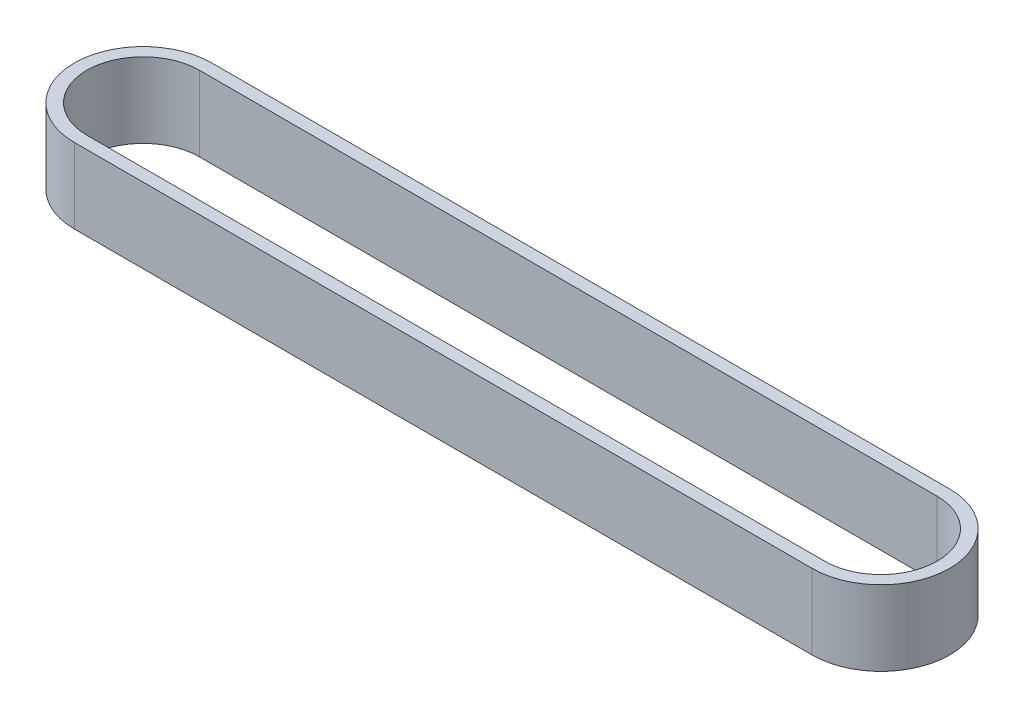
ISO-10303-21;
HEADER;
FILE_DESCRIPTION(('STEP AP214'),'2;1');
FILE_NAME('part.step','',(''),(''),'','','');
FILE_SCHEMA(('AUTOMOTIVE_DESIGN { 1 0 10303 214 1 1 1 1 }'));
ENDSEC;
DATA;
#1=APPLICATION_CONTEXT('core data for automotive mechanical design processes');
#2=APPLICATION_PROTOCOL_DEFINITION('international standard','automotive_design',2000,#1);
#3=PRODUCT_CONTEXT('',#1,'mechanical');
#4=PRODUCT('Part','Part','',(#3));
#5=PRODUCT_RELATED_PRODUCT_CATEGORY('part','',(#4));
#6=PRODUCT_DEFINITION_FORMATION('','',#4);
#7=PRODUCT_DEFINITION_CONTEXT('part definition',#1,'design');
#8=PRODUCT_DEFINITION('design','',#6,#7);
#9=PRODUCT_DEFINITION_SHAPE('','',#8);
#10=(LENGTH_UNIT() NAMED_UNIT(*) SI_UNIT(.MILLI.,.METRE.));
#11=(NAMED_UNIT(*) PLANE_ANGLE_UNIT() SI_UNIT($,.RADIAN.));
#12=(NAMED_UNIT(*) SI_UNIT($,.STERADIAN.) SOLID_ANGLE_UNIT());
#13=UNCERTAINTY_MEASURE_WITH_UNIT(LENGTH_MEASURE(1.E-05),#10,'distance_accuracy_value','');
#14=(GEOMETRIC_REPRESENTATION_CONTEXT(3) GLOBAL_UNCERTAINTY_ASSIGNED_CONTEXT((#13)) GLOBAL_UNIT_ASSIGNED_CONTEXT((#10,
#11,#12)) REPRESENTATION_CONTEXT('',''));
#15=CARTESIAN_POINT('',(0.,0.,0.));
#16=DIRECTION('',(0.,0.,1.));
#17=DIRECTION('',(1.,0.,0.));
#18=AXIS2_PLACEMENT_3D('',#15,#16,#17);
#19=CARTESIAN_POINT('',(-29.5,6.,0.));
#20=DIRECTION('',(0.,1.,0.));
#21=DIRECTION('',(0.,0.,1.));
#22=AXIS2_PLACEMENT_3D('',#19,#20,#21);
#23=PLANE('',#22);
#24=CARTESIAN_POINT('',(-29.5,6.,0.));
#25=DIRECTION('',(0.,1.,0.));
#26=DIRECTION('',(1.,0.,0.));
#27=AXIS2_PLACEMENT_3D('',#24,#25,#26);
#28=CIRCLE('',#27,5.50000000000001);
#29=CARTESIAN_POINT('',(-29.5,6.,-5.50000000000001));
#30=VERTEX_POINT('',#29);
#31=CARTESIAN_POINT('',(-29.5,6.,5.50000000000001));
#32=VERTEX_POINT('',#31);
#33=EDGE_CURVE('E159',#30,#32,#28,.T.);
#34=ORIENTED_EDGE('',*,*,#33,.T.);
#35=DIRECTION('',(1.,0.,0.));
#36=VECTOR('',#35,1.);
#37=CARTESIAN_POINT('',(-29.5,6.,5.50000000000001));
#38=LINE('',#37,#36);
#39=CARTESIAN_POINT('',(29.5,6.,5.5));
#40=VERTEX_POINT('',#39);
#41=EDGE_CURVE('E162',#32,#40,#38,.T.);
#42=ORIENTED_EDGE('',*,*,#41,.T.);
#43=CARTESIAN_POINT('',(29.5,6.,0.));
#44=DIRECTION('',(0.,1.,0.));
#45=DIRECTION('',(1.,0.,0.));
#46=AXIS2_PLACEMENT_3D('',#43,#44,#45);
#47=CIRCLE('',#46,5.50000000000001);
#48=CARTESIAN_POINT('',(29.5,6.,-5.50000000000002));
#49=VERTEX_POINT('',#48);
#50=EDGE_CURVE('E165',#40,#49,#47,.T.);
#51=ORIENTED_EDGE('',*,*,#50,.T.);
#52=DIRECTION('',(-1.,0.,0.));
#53=VECTOR('',#52,1.);
#54=CARTESIAN_POINT('',(-29.5,6.,-5.50000000000001));
#55=LINE('',#54,#53);
#56=EDGE_CURVE('E167',#49,#30,#55,.T.);
#57=ORIENTED_EDGE('',*,*,#56,.T.);
#58=EDGE_LOOP('',(#34,#42,#51,#57));
#59=FACE_BOUND('',#58,.T.);
#60=DIRECTION('',(1.,0.,0.));
#61=VECTOR('',#60,1.);
#62=CARTESIAN_POINT('',(-29.5,6.,4.50000000000001));
#63=LINE('',#62,#61);
#64=CARTESIAN_POINT('',(-29.5,6.,4.50000000000001));
#65=VERTEX_POINT('',#64);
#66=CARTESIAN_POINT('',(29.5,6.,4.5));
#67=VERTEX_POINT('',#66);
#68=EDGE_CURVE('E131',#65,#67,#63,.T.);
#69=ORIENTED_EDGE('',*,*,#68,.F.);
#70=CARTESIAN_POINT('',(-29.5,6.,0.));
#71=DIRECTION('',(0.,1.,0.));
#72=DIRECTION('',(0.,0.,1.));
#73=AXIS2_PLACEMENT_3D('',#70,#71,#72);
#74=CIRCLE('',#73,4.50000000000001);
#75=CARTESIAN_POINT('',(-29.5,6.,-4.50000000000001));
#76=VERTEX_POINT('',#75);
#77=EDGE_CURVE('E123',#76,#65,#74,.T.);
#78=ORIENTED_EDGE('',*,*,#77,.F.);
#79=DIRECTION('',(-1.,0.,0.));
#80=VECTOR('',#79,1.);
#81=CARTESIAN_POINT('',(-29.5,6.,-4.50000000000001));
#82=LINE('',#81,#80);
#83=CARTESIAN_POINT('',(29.5,6.,-4.50000000000002));
#84=VERTEX_POINT('',#83);
#85=EDGE_CURVE('E145',#84,#76,#82,.T.);
#86=ORIENTED_EDGE('',*,*,#85,.F.);
#87=CARTESIAN_POINT('',(29.5,6.,0.));
#88=DIRECTION('',(0.,1.,0.));
#89=DIRECTION('',(0.,0.,1.));
#90=AXIS2_PLACEMENT_3D('',#87,#88,#89);
#91=CIRCLE('',#90,4.50000000000001);
#92=EDGE_CURVE('E143',#67,#84,#91,.T.);
#93=ORIENTED_EDGE('',*,*,#92,.F.);
#94=EDGE_LOOP('',(#69,#78,#86,#93));
#95=FACE_BOUND('',#94,.T.);
#96=ADVANCED_FACE('F58',(#59,#95),#23,.T.);
#97=CARTESIAN_POINT('',(-29.5,0.,0.));
#98=DIRECTION('',(0.,1.,0.));
#99=DIRECTION('',(0.,0.,1.));
#100=AXIS2_PLACEMENT_3D('',#97,#98,#99);
#101=PLANE('',#100);
#102=CARTESIAN_POINT('',(-29.5,0.,0.));
#103=DIRECTION('',(0.,1.,0.));
#104=DIRECTION('',(1.,0.,0.));
#105=AXIS2_PLACEMENT_3D('',#102,#103,#104);
#106=CIRCLE('',#105,5.50000000000001);
#107=CARTESIAN_POINT('',(-29.5,0.,-5.50000000000001));
#108=VERTEX_POINT('',#107);
#109=CARTESIAN_POINT('',(-29.5,0.,5.50000000000001));
#110=VERTEX_POINT('',#109);
#111=EDGE_CURVE('E139',#108,#110,#106,.T.);
#112=ORIENTED_EDGE('',*,*,#111,.F.);
#113=DIRECTION('',(-1.,0.,0.));
#114=VECTOR('',#113,1.);
#115=CARTESIAN_POINT('',(-29.5,0.,-5.50000000000001));
#116=LINE('',#115,#114);
#117=CARTESIAN_POINT('',(29.5,0.,-5.50000000000002));
#118=VERTEX_POINT('',#117);
#119=EDGE_CURVE('E163',#118,#108,#116,.T.);
#120=ORIENTED_EDGE('',*,*,#119,.F.);
#121=CARTESIAN_POINT('',(29.5,0.,0.));
#122=DIRECTION('',(0.,1.,0.));
#123=DIRECTION('',(1.,0.,0.));
#124=AXIS2_PLACEMENT_3D('',#121,#122,#123);
#125=CIRCLE('',#124,5.50000000000001);
#126=CARTESIAN_POINT('',(29.5,0.,5.5));
#127=VERTEX_POINT('',#126);
#128=EDGE_CURVE('E174',#127,#118,#125,.T.);
#129=ORIENTED_EDGE('',*,*,#128,.F.);
#130=DIRECTION('',(1.,0.,0.));
#131=VECTOR('',#130,1.);
#132=CARTESIAN_POINT('',(-29.5,0.,5.50000000000001));
#133=LINE('',#132,#131);
#134=EDGE_CURVE('E172',#110,#127,#133,.T.);
#135=ORIENTED_EDGE('',*,*,#134,.F.);
#136=EDGE_LOOP('',(#112,#120,#129,#135));
#137=FACE_BOUND('',#136,.T.);
#138=CARTESIAN_POINT('',(-29.5,0.,0.));
#139=DIRECTION('',(0.,1.,0.));
#140=DIRECTION('',(0.,0.,1.));
#141=AXIS2_PLACEMENT_3D('',#138,#139,#140);
#142=CIRCLE('',#141,4.50000000000001);
#143=CARTESIAN_POINT('',(-29.5,0.,-4.50000000000001));
#144=VERTEX_POINT('',#143);
#145=CARTESIAN_POINT('',(-29.5,0.,4.50000000000001));
#146=VERTEX_POINT('',#145);
#147=EDGE_CURVE('E81',#144,#146,#142,.T.);
#148=ORIENTED_EDGE('',*,*,#147,.T.);
#149=DIRECTION('',(1.,0.,0.));
#150=VECTOR('',#149,1.);
#151=CARTESIAN_POINT('',(-29.5,0.,4.50000000000001));
#152=LINE('',#151,#150);
#153=CARTESIAN_POINT('',(29.5,0.,4.5));
#154=VERTEX_POINT('',#153);
#155=EDGE_CURVE('E138',#146,#154,#152,.T.);
#156=ORIENTED_EDGE('',*,*,#155,.T.);
#157=CARTESIAN_POINT('',(29.5,0.,0.));
#158=DIRECTION('',(0.,1.,0.));
#159=DIRECTION('',(0.,0.,1.));
#160=AXIS2_PLACEMENT_3D('',#157,#158,#159);
#161=CIRCLE('',#160,4.50000000000001);
#162=CARTESIAN_POINT('',(29.5,0.,-4.50000000000002));
#163=VERTEX_POINT('',#162);
#164=EDGE_CURVE('E151',#154,#163,#161,.T.);
#165=ORIENTED_EDGE('',*,*,#164,.T.);
#166=DIRECTION('',(-1.,0.,0.));
#167=VECTOR('',#166,1.);
#168=CARTESIAN_POINT('',(-29.5,0.,-4.50000000000001));
#169=LINE('',#168,#167);
#170=EDGE_CURVE('E132',#163,#144,#169,.T.);
#171=ORIENTED_EDGE('',*,*,#170,.T.);
#172=EDGE_LOOP('',(#148,#156,#165,#171));
#173=FACE_BOUND('',#172,.T.);
#174=ADVANCED_FACE('F192',(#137,#173),#101,.F.);
#175=CARTESIAN_POINT('',(-29.5,6.,0.));
#176=DIRECTION('',(0.,-1.,0.));
#177=DIRECTION('',(0.,0.,-1.));
#178=AXIS2_PLACEMENT_3D('',#175,#176,#177);
#179=CYLINDRICAL_SURFACE('',#178,5.50000000000001);
#180=ORIENTED_EDGE('',*,*,#111,.T.);
#181=DIRECTION('',(0.,-1.,0.));
#182=VECTOR('',#181,1.);
#183=CARTESIAN_POINT('',(-29.5,6.,5.50000000000001));
#184=LINE('',#183,#182);
#185=EDGE_CURVE('E12',#32,#110,#184,.T.);
#186=ORIENTED_EDGE('',*,*,#185,.F.);
#187=ORIENTED_EDGE('',*,*,#33,.F.);
#188=DIRECTION('',(0.,-1.,0.));
#189=VECTOR('',#188,1.);
#190=CARTESIAN_POINT('',(-29.5,6.,-5.50000000000001));
#191=LINE('',#190,#189);
#192=EDGE_CURVE('E169',#30,#108,#191,.T.);
#193=ORIENTED_EDGE('',*,*,#192,.T.);
#194=EDGE_LOOP('',(#180,#186,#187,#193));
#195=FACE_BOUND('',#194,.T.);
#196=ADVANCED_FACE('F60',(#195),#179,.T.);
#197=CARTESIAN_POINT('',(-29.5,6.,5.50000000000001));
#198=DIRECTION('',(0.,0.,-1.));
#199=DIRECTION('',(-1.,0.,0.));
#200=AXIS2_PLACEMENT_3D('',#197,#198,#199);
#201=PLANE('',#200);
#202=ORIENTED_EDGE('',*,*,#134,.T.);
#203=DIRECTION('',(0.,-1.,0.));
#204=VECTOR('',#203,1.);
#205=CARTESIAN_POINT('',(29.5,6.,5.5));
#206=LINE('',#205,#204);
#207=EDGE_CURVE('E66',#40,#127,#206,.T.);
#208=ORIENTED_EDGE('',*,*,#207,.F.);
#209=ORIENTED_EDGE('',*,*,#41,.F.);
#210=ORIENTED_EDGE('',*,*,#185,.T.);
#211=EDGE_LOOP('',(#202,#208,#209,#210));
#212=FACE_BOUND('',#211,.T.);
#213=ADVANCED_FACE('F202',(#212),#201,.F.);
#214=CARTESIAN_POINT('',(29.5,6.,0.));
#215=DIRECTION('',(0.,-1.,0.));
#216=DIRECTION('',(0.,0.,-1.));
#217=AXIS2_PLACEMENT_3D('',#214,#215,#216);
#218=CYLINDRICAL_SURFACE('',#217,5.50000000000001);
#219=ORIENTED_EDGE('',*,*,#128,.T.);
#220=DIRECTION('',(0.,-1.,0.));
#221=VECTOR('',#220,1.);
#222=CARTESIAN_POINT('',(29.5,6.,-5.50000000000002));
#223=LINE('',#222,#221);
#224=EDGE_CURVE('E179',#49,#118,#223,.T.);
#225=ORIENTED_EDGE('',*,*,#224,.F.);
#226=ORIENTED_EDGE('',*,*,#50,.F.);
#227=ORIENTED_EDGE('',*,*,#207,.T.);
#228=EDGE_LOOP('',(#219,#225,#226,#227));
#229=FACE_BOUND('',#228,.T.);
#230=ADVANCED_FACE('F186',(#229),#218,.T.);
#231=CARTESIAN_POINT('',(-29.5,6.,-5.50000000000001));
#232=DIRECTION('',(0.,0.,1.));
#233=DIRECTION('',(1.,0.,0.));
#234=AXIS2_PLACEMENT_3D('',#231,#232,#233);
#235=PLANE('',#234);
#236=ORIENTED_EDGE('',*,*,#119,.T.);
#237=ORIENTED_EDGE('',*,*,#192,.F.);
#238=ORIENTED_EDGE('',*,*,#56,.F.);
#239=ORIENTED_EDGE('',*,*,#224,.T.);
#240=EDGE_LOOP('',(#236,#237,#238,#239));
#241=FACE_BOUND('',#240,.T.);
#242=ADVANCED_FACE('F196',(#241),#235,.F.);
#243=CARTESIAN_POINT('',(-29.5,6.,0.));
#244=DIRECTION('',(0.,-1.,0.));
#245=DIRECTION('',(0.,0.,-1.));
#246=AXIS2_PLACEMENT_3D('',#243,#244,#245);
#247=CYLINDRICAL_SURFACE('',#246,4.50000000000001);
#248=ORIENTED_EDGE('',*,*,#147,.F.);
#249=DIRECTION('',(0.,-1.,0.));
#250=VECTOR('',#249,1.);
#251=CARTESIAN_POINT('',(-29.5,6.,-4.50000000000001));
#252=LINE('',#251,#250);
#253=EDGE_CURVE('E127',#76,#144,#252,.T.);
#254=ORIENTED_EDGE('',*,*,#253,.F.);
#255=ORIENTED_EDGE('',*,*,#77,.T.);
#256=DIRECTION('',(0.,-1.,0.));
#257=VECTOR('',#256,1.);
#258=CARTESIAN_POINT('',(-29.5,6.,4.50000000000001));
#259=LINE('',#258,#257);
#260=EDGE_CURVE('E126',#65,#146,#259,.T.);
#261=ORIENTED_EDGE('',*,*,#260,.T.);
#262=EDGE_LOOP('',(#248,#254,#255,#261));
#263=FACE_BOUND('',#262,.T.);
#264=ADVANCED_FACE('F125',(#263),#247,.F.);
#265=CARTESIAN_POINT('',(-29.5,6.,4.50000000000001));
#266=DIRECTION('',(0.,0.,-1.));
#267=DIRECTION('',(-1.,0.,0.));
#268=AXIS2_PLACEMENT_3D('',#265,#266,#267);
#269=PLANE('',#268);
#270=ORIENTED_EDGE('',*,*,#155,.F.);
#271=ORIENTED_EDGE('',*,*,#260,.F.);
#272=ORIENTED_EDGE('',*,*,#68,.T.);
#273=DIRECTION('',(0.,-1.,0.));
#274=VECTOR('',#273,1.);
#275=CARTESIAN_POINT('',(29.5,6.,4.5));
#276=LINE('',#275,#274);
#277=EDGE_CURVE('E140',#67,#154,#276,.T.);
#278=ORIENTED_EDGE('',*,*,#277,.T.);
#279=EDGE_LOOP('',(#270,#271,#272,#278));
#280=FACE_BOUND('',#279,.T.);
#281=ADVANCED_FACE('F135',(#280),#269,.T.);
#282=CARTESIAN_POINT('',(29.5,6.,0.));
#283=DIRECTION('',(0.,-1.,0.));
#284=DIRECTION('',(0.,0.,-1.));
#285=AXIS2_PLACEMENT_3D('',#282,#283,#284);
#286=CYLINDRICAL_SURFACE('',#285,4.50000000000001);
#287=ORIENTED_EDGE('',*,*,#164,.F.);
#288=ORIENTED_EDGE('',*,*,#277,.F.);
#289=ORIENTED_EDGE('',*,*,#92,.T.);
#290=DIRECTION('',(0.,-1.,0.));
#291=VECTOR('',#290,1.);
#292=CARTESIAN_POINT('',(29.5,6.,-4.50000000000002));
#293=LINE('',#292,#291);
#294=EDGE_CURVE('E73',#84,#163,#293,.T.);
#295=ORIENTED_EDGE('',*,*,#294,.T.);
#296=EDGE_LOOP('',(#287,#288,#289,#295));
#297=FACE_BOUND('',#296,.T.);
#298=ADVANCED_FACE('F225',(#297),#286,.F.);
#299=CARTESIAN_POINT('',(-29.5,6.,-4.50000000000001));
#300=DIRECTION('',(0.,0.,1.));
#301=DIRECTION('',(1.,0.,0.));
#302=AXIS2_PLACEMENT_3D('',#299,#300,#301);
#303=PLANE('',#302);
#304=ORIENTED_EDGE('',*,*,#170,.F.);
#305=ORIENTED_EDGE('',*,*,#294,.F.);
#306=ORIENTED_EDGE('',*,*,#85,.T.);
#307=ORIENTED_EDGE('',*,*,#253,.T.);
#308=EDGE_LOOP('',(#304,#305,#306,#307));
#309=FACE_BOUND('',#308,.T.);
#310=ADVANCED_FACE('F229',(#309),#303,.T.);
#311=CLOSED_SHELL('',(#96,#174,#196,#213,#230,#242,#264,#281,#298,#310));
#312=MANIFOLD_SOLID_BREP('B2',#311);
#313=ADVANCED_BREP_SHAPE_REPRESENTATION('',(#18,#312),#14);
#314=SHAPE_DEFINITION_REPRESENTATION(#9,#313);
ENDSEC;
END-ISO-10303-21;
